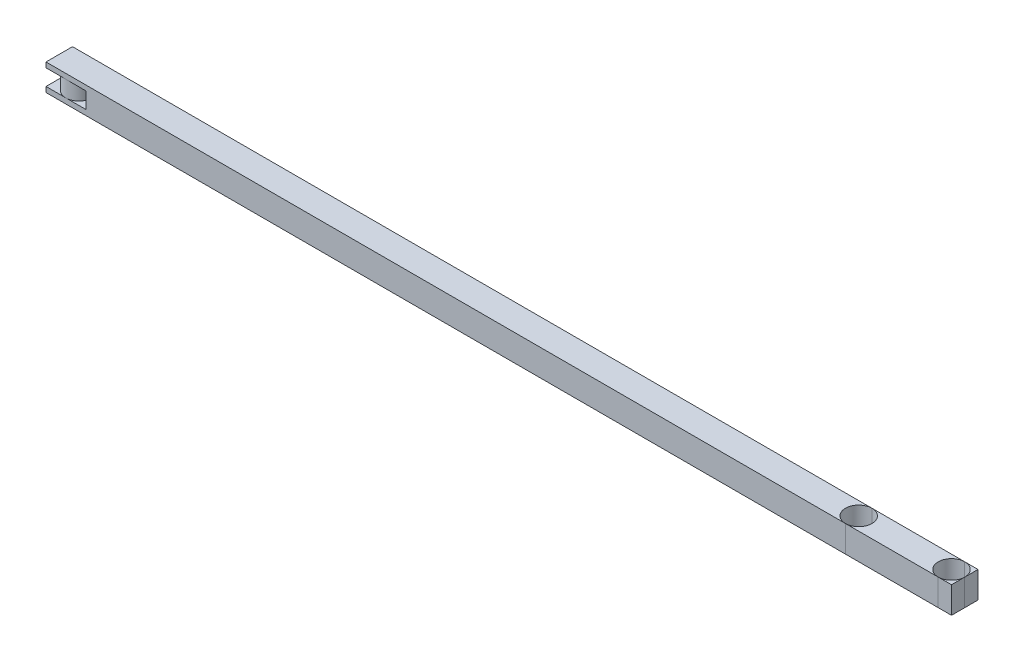
ISO-10303-21;
HEADER;
FILE_DESCRIPTION(('STEP AP214'),'2;1');
FILE_NAME('part.step','',(''),(''),'','','');
FILE_SCHEMA(('AUTOMOTIVE_DESIGN { 1 0 10303 214 1 1 1 1 }'));
ENDSEC;
DATA;
#1=APPLICATION_CONTEXT('core data for automotive mechanical design processes');
#2=APPLICATION_PROTOCOL_DEFINITION('international standard','automotive_design',2000,#1);
#3=PRODUCT_CONTEXT('',#1,'mechanical');
#4=PRODUCT('Part','Part','',(#3));
#5=PRODUCT_RELATED_PRODUCT_CATEGORY('part','',(#4));
#6=PRODUCT_DEFINITION_FORMATION('','',#4);
#7=PRODUCT_DEFINITION_CONTEXT('part definition',#1,'design');
#8=PRODUCT_DEFINITION('design','',#6,#7);
#9=PRODUCT_DEFINITION_SHAPE('','',#8);
#10=(LENGTH_UNIT() NAMED_UNIT(*) SI_UNIT(.MILLI.,.METRE.));
#11=(NAMED_UNIT(*) PLANE_ANGLE_UNIT() SI_UNIT($,.RADIAN.));
#12=(NAMED_UNIT(*) SI_UNIT($,.STERADIAN.) SOLID_ANGLE_UNIT());
#13=UNCERTAINTY_MEASURE_WITH_UNIT(LENGTH_MEASURE(1.E-05),#10,'distance_accuracy_value','');
#14=(GEOMETRIC_REPRESENTATION_CONTEXT(3) GLOBAL_UNCERTAINTY_ASSIGNED_CONTEXT((#13)) GLOBAL_UNIT_ASSIGNED_CONTEXT((#10,
#11,#12)) REPRESENTATION_CONTEXT('',''));
#15=CARTESIAN_POINT('',(0.,0.,0.));
#16=DIRECTION('',(0.,0.,1.));
#17=DIRECTION('',(1.,0.,0.));
#18=AXIS2_PLACEMENT_3D('',#15,#16,#17);
#19=CARTESIAN_POINT('',(0.,0.,5.));
#20=DIRECTION('',(0.,0.,-1.));
#21=DIRECTION('',(-1.,0.,0.));
#22=AXIS2_PLACEMENT_3D('',#19,#20,#21);
#23=PLANE('',#22);
#24=DIRECTION('',(1.,0.,0.));
#25=VECTOR('',#24,1.);
#26=CARTESIAN_POINT('',(170.8,-5.,5.));
#27=LINE('',#26,#25);
#28=CARTESIAN_POINT('',(0.,-5.00000000000005,5.));
#29=VERTEX_POINT('',#28);
#30=CARTESIAN_POINT('',(150.8,-5.00000000000001,5.));
#31=VERTEX_POINT('',#30);
#32=EDGE_CURVE('E148',#29,#31,#27,.T.);
#33=ORIENTED_EDGE('',*,*,#32,.T.);
#34=DIRECTION('',(0.,1.,0.));
#35=VECTOR('',#34,1.);
#36=CARTESIAN_POINT('',(150.8,-10.,5.));
#37=LINE('',#36,#35);
#38=CARTESIAN_POINT('',(150.8,0.,5.));
#39=VERTEX_POINT('',#38);
#40=EDGE_CURVE('E69',#31,#39,#37,.T.);
#41=ORIENTED_EDGE('',*,*,#40,.T.);
#42=DIRECTION('',(-1.,0.,0.));
#43=VECTOR('',#42,1.);
#44=CARTESIAN_POINT('',(0.,0.,5.));
#45=LINE('',#44,#43);
#46=CARTESIAN_POINT('',(0.,0.,5.));
#47=VERTEX_POINT('',#46);
#48=EDGE_CURVE('E150',#39,#47,#45,.T.);
#49=ORIENTED_EDGE('',*,*,#48,.T.);
#50=DIRECTION('',(0.,-1.,0.));
#51=VECTOR('',#50,1.);
#52=CARTESIAN_POINT('',(0.,-0.958682323824163,5.));
#53=LINE('',#52,#51);
#54=CARTESIAN_POINT('',(0.,-0.958682323824163,5.));
#55=VERTEX_POINT('',#54);
#56=EDGE_CURVE('E152',#47,#55,#53,.T.);
#57=ORIENTED_EDGE('',*,*,#56,.T.);
#58=DIRECTION('',(1.,0.,0.));
#59=VECTOR('',#58,1.);
#60=CARTESIAN_POINT('',(0.,-0.958682323824163,5.));
#61=LINE('',#60,#59);
#62=CARTESIAN_POINT('',(3.75,-0.958682323824163,5.));
#63=VERTEX_POINT('',#62);
#64=EDGE_CURVE('E172',#55,#63,#61,.T.);
#65=ORIENTED_EDGE('',*,*,#64,.T.);
#66=CARTESIAN_POINT('',(7.5,-0.958682323824163,5.));
#67=VERTEX_POINT('',#66);
#68=EDGE_CURVE('E174',#63,#67,#61,.T.);
#69=ORIENTED_EDGE('',*,*,#68,.T.);
#70=DIRECTION('',(0.,-1.,0.));
#71=VECTOR('',#70,1.);
#72=CARTESIAN_POINT('',(7.5,-0.958682323824163,5.));
#73=LINE('',#72,#71);
#74=CARTESIAN_POINT('',(7.5,-4.00000000000005,5.));
#75=VERTEX_POINT('',#74);
#76=EDGE_CURVE('E180',#67,#75,#73,.T.);
#77=ORIENTED_EDGE('',*,*,#76,.T.);
#78=DIRECTION('',(-1.,0.,0.));
#79=VECTOR('',#78,1.);
#80=CARTESIAN_POINT('',(7.5,-4.00000000000005,5.));
#81=LINE('',#80,#79);
#82=CARTESIAN_POINT('',(3.75,-4.00000000000005,5.));
#83=VERTEX_POINT('',#82);
#84=EDGE_CURVE('E182',#75,#83,#81,.T.);
#85=ORIENTED_EDGE('',*,*,#84,.T.);
#86=CARTESIAN_POINT('',(0.,-4.00000000000005,5.));
#87=VERTEX_POINT('',#86);
#88=EDGE_CURVE('E185',#83,#87,#81,.T.);
#89=ORIENTED_EDGE('',*,*,#88,.T.);
#90=DIRECTION('',(0.,-1.,0.));
#91=VECTOR('',#90,1.);
#92=CARTESIAN_POINT('',(0.,-5.00000000000005,5.));
#93=LINE('',#92,#91);
#94=EDGE_CURVE('E186',#87,#29,#93,.T.);
#95=ORIENTED_EDGE('',*,*,#94,.T.);
#96=EDGE_LOOP('',(#33,#41,#49,#57,#65,#69,#77,#85,#89,#95));
#97=FACE_BOUND('',#96,.T.);
#98=ADVANCED_FACE('F52',(#97),#23,.F.);
#99=CARTESIAN_POINT('',(0.,0.,0.));
#100=DIRECTION('',(0.,0.,-1.));
#101=DIRECTION('',(-1.,0.,0.));
#102=AXIS2_PLACEMENT_3D('',#99,#100,#101);
#103=PLANE('',#102);
#104=DIRECTION('',(0.,1.,0.));
#105=VECTOR('',#104,1.);
#106=CARTESIAN_POINT('',(150.8,-10.,0.));
#107=LINE('',#106,#105);
#108=CARTESIAN_POINT('',(150.8,-5.00000000000001,0.));
#109=VERTEX_POINT('',#108);
#110=CARTESIAN_POINT('',(150.8,0.,0.));
#111=VERTEX_POINT('',#110);
#112=EDGE_CURVE('E12',#109,#111,#107,.T.);
#113=ORIENTED_EDGE('',*,*,#112,.F.);
#114=DIRECTION('',(1.,0.,0.));
#115=VECTOR('',#114,1.);
#116=CARTESIAN_POINT('',(170.8,-5.,0.));
#117=LINE('',#116,#115);
#118=CARTESIAN_POINT('',(0.,-5.00000000000005,0.));
#119=VERTEX_POINT('',#118);
#120=EDGE_CURVE('E129',#119,#109,#117,.T.);
#121=ORIENTED_EDGE('',*,*,#120,.F.);
#122=DIRECTION('',(0.,-1.,0.));
#123=VECTOR('',#122,1.);
#124=CARTESIAN_POINT('',(0.,-5.00000000000005,0.));
#125=LINE('',#124,#123);
#126=CARTESIAN_POINT('',(0.,-4.00000000000005,0.));
#127=VERTEX_POINT('',#126);
#128=EDGE_CURVE('E143',#127,#119,#125,.T.);
#129=ORIENTED_EDGE('',*,*,#128,.F.);
#130=DIRECTION('',(-1.,0.,0.));
#131=VECTOR('',#130,1.);
#132=CARTESIAN_POINT('',(7.5,-4.00000000000005,0.));
#133=LINE('',#132,#131);
#134=CARTESIAN_POINT('',(3.75,-4.00000000000005,0.));
#135=VERTEX_POINT('',#134);
#136=EDGE_CURVE('E189',#135,#127,#133,.T.);
#137=ORIENTED_EDGE('',*,*,#136,.F.);
#138=CARTESIAN_POINT('',(7.5,-4.00000000000005,0.));
#139=VERTEX_POINT('',#138);
#140=EDGE_CURVE('E196',#139,#135,#133,.T.);
#141=ORIENTED_EDGE('',*,*,#140,.F.);
#142=DIRECTION('',(0.,-1.,0.));
#143=VECTOR('',#142,1.);
#144=CARTESIAN_POINT('',(7.5,-0.958682323824163,0.));
#145=LINE('',#144,#143);
#146=CARTESIAN_POINT('',(7.5,-0.958682323824163,0.));
#147=VERTEX_POINT('',#146);
#148=EDGE_CURVE('E193',#147,#139,#145,.T.);
#149=ORIENTED_EDGE('',*,*,#148,.F.);
#150=DIRECTION('',(1.,0.,0.));
#151=VECTOR('',#150,1.);
#152=CARTESIAN_POINT('',(0.,-0.958682323824163,0.));
#153=LINE('',#152,#151);
#154=CARTESIAN_POINT('',(3.75,-0.958682323824163,0.));
#155=VERTEX_POINT('',#154);
#156=EDGE_CURVE('E165',#155,#147,#153,.T.);
#157=ORIENTED_EDGE('',*,*,#156,.F.);
#158=CARTESIAN_POINT('',(0.,-0.958682323824163,0.));
#159=VERTEX_POINT('',#158);
#160=EDGE_CURVE('E190',#159,#155,#153,.T.);
#161=ORIENTED_EDGE('',*,*,#160,.F.);
#162=DIRECTION('',(0.,-1.,0.));
#163=VECTOR('',#162,1.);
#164=CARTESIAN_POINT('',(0.,-0.958682323824163,0.));
#165=LINE('',#164,#163);
#166=CARTESIAN_POINT('',(0.,0.,0.));
#167=VERTEX_POINT('',#166);
#168=EDGE_CURVE('E166',#167,#159,#165,.T.);
#169=ORIENTED_EDGE('',*,*,#168,.F.);
#170=DIRECTION('',(-1.,0.,0.));
#171=VECTOR('',#170,1.);
#172=CARTESIAN_POINT('',(0.,0.,0.));
#173=LINE('',#172,#171);
#174=EDGE_CURVE('E135',#111,#167,#173,.T.);
#175=ORIENTED_EDGE('',*,*,#174,.F.);
#176=EDGE_LOOP('',(#113,#121,#129,#137,#141,#149,#157,#161,#169,#175));
#177=FACE_BOUND('',#176,.T.);
#178=ADVANCED_FACE('F132',(#177),#103,.T.);
#179=CARTESIAN_POINT('',(0.,-0.958682323824163,5.));
#180=DIRECTION('',(0.,1.,0.));
#181=DIRECTION('',(0.,0.,1.));
#182=AXIS2_PLACEMENT_3D('',#179,#180,#181);
#183=PLANE('',#182);
#184=CARTESIAN_POINT('',(3.75,-0.958682323824163,2.5));
#185=DIRECTION('',(0.,-1.,0.));
#186=DIRECTION('',(0.,0.,-1.));
#187=AXIS2_PLACEMENT_3D('',#184,#185,#186);
#188=CIRCLE('',#187,2.5);
#189=EDGE_CURVE('E62',#63,#155,#188,.T.);
#190=ORIENTED_EDGE('',*,*,#189,.F.);
#191=ORIENTED_EDGE('',*,*,#64,.F.);
#192=DIRECTION('',(0.,0.,-1.));
#193=VECTOR('',#192,1.);
#194=CARTESIAN_POINT('',(0.,-0.958682323824163,5.));
#195=LINE('',#194,#193);
#196=EDGE_CURVE('E171',#55,#159,#195,.T.);
#197=ORIENTED_EDGE('',*,*,#196,.T.);
#198=ORIENTED_EDGE('',*,*,#160,.T.);
#199=EDGE_LOOP('',(#190,#191,#197,#198));
#200=FACE_BOUND('',#199,.T.);
#201=ADVANCED_FACE('F207',(#200),#183,.F.);
#202=CARTESIAN_POINT('',(7.5,-4.00000000000005,5.));
#203=DIRECTION('',(0.,-1.,0.));
#204=DIRECTION('',(1.,0.,0.));
#205=AXIS2_PLACEMENT_3D('',#202,#203,#204);
#206=PLANE('',#205);
#207=CARTESIAN_POINT('',(3.75,-4.00000000000005,2.5));
#208=DIRECTION('',(0.,-1.,0.));
#209=DIRECTION('',(1.,0.,0.));
#210=AXIS2_PLACEMENT_3D('',#207,#208,#209);
#211=CIRCLE('',#210,2.5);
#212=EDGE_CURVE('E177',#83,#135,#211,.T.);
#213=ORIENTED_EDGE('',*,*,#212,.T.);
#214=ORIENTED_EDGE('',*,*,#136,.T.);
#215=DIRECTION('',(0.,0.,-1.));
#216=VECTOR('',#215,1.);
#217=CARTESIAN_POINT('',(0.,-4.00000000000005,5.));
#218=LINE('',#217,#216);
#219=EDGE_CURVE('E140',#87,#127,#218,.T.);
#220=ORIENTED_EDGE('',*,*,#219,.F.);
#221=ORIENTED_EDGE('',*,*,#88,.F.);
#222=EDGE_LOOP('',(#213,#214,#220,#221));
#223=FACE_BOUND('',#222,.T.);
#224=ADVANCED_FACE('F238',(#223),#206,.F.);
#225=CARTESIAN_POINT('',(0.,-0.958682323824163,5.));
#226=DIRECTION('',(1.,0.,0.));
#227=DIRECTION('',(0.,1.,0.));
#228=AXIS2_PLACEMENT_3D('',#225,#226,#227);
#229=PLANE('',#228);
#230=ORIENTED_EDGE('',*,*,#168,.T.);
#231=ORIENTED_EDGE('',*,*,#196,.F.);
#232=ORIENTED_EDGE('',*,*,#56,.F.);
#233=DIRECTION('',(0.,0.,-1.));
#234=VECTOR('',#233,1.);
#235=CARTESIAN_POINT('',(0.,0.,5.));
#236=LINE('',#235,#234);
#237=EDGE_CURVE('E161',#47,#167,#236,.T.);
#238=ORIENTED_EDGE('',*,*,#237,.T.);
#239=EDGE_LOOP('',(#230,#231,#232,#238));
#240=FACE_BOUND('',#239,.T.);
#241=ADVANCED_FACE('F169',(#240),#229,.F.);
#242=EDGE_CURVE('E218',#155,#63,#188,.T.);
#243=ORIENTED_EDGE('',*,*,#242,.F.);
#244=ORIENTED_EDGE('',*,*,#156,.T.);
#245=DIRECTION('',(0.,0.,-1.));
#246=VECTOR('',#245,1.);
#247=CARTESIAN_POINT('',(7.5,-0.958682323824163,5.));
#248=LINE('',#247,#246);
#249=EDGE_CURVE('E195',#67,#147,#248,.T.);
#250=ORIENTED_EDGE('',*,*,#249,.F.);
#251=ORIENTED_EDGE('',*,*,#68,.F.);
#252=EDGE_LOOP('',(#243,#244,#250,#251));
#253=FACE_BOUND('',#252,.T.);
#254=ADVANCED_FACE('F214',(#253),#183,.F.);
#255=CARTESIAN_POINT('',(7.5,-0.958682323824163,5.));
#256=DIRECTION('',(1.,0.,0.));
#257=DIRECTION('',(0.,0.,-1.));
#258=AXIS2_PLACEMENT_3D('',#255,#256,#257);
#259=PLANE('',#258);
#260=ORIENTED_EDGE('',*,*,#148,.T.);
#261=DIRECTION('',(0.,0.,-1.));
#262=VECTOR('',#261,1.);
#263=CARTESIAN_POINT('',(7.5,-4.00000000000005,5.));
#264=LINE('',#263,#262);
#265=EDGE_CURVE('E198',#75,#139,#264,.T.);
#266=ORIENTED_EDGE('',*,*,#265,.F.);
#267=ORIENTED_EDGE('',*,*,#76,.F.);
#268=ORIENTED_EDGE('',*,*,#249,.T.);
#269=EDGE_LOOP('',(#260,#266,#267,#268));
#270=FACE_BOUND('',#269,.T.);
#271=ADVANCED_FACE('F220',(#270),#259,.F.);
#272=EDGE_CURVE('E203',#135,#83,#211,.T.);
#273=ORIENTED_EDGE('',*,*,#272,.T.);
#274=ORIENTED_EDGE('',*,*,#84,.F.);
#275=ORIENTED_EDGE('',*,*,#265,.T.);
#276=ORIENTED_EDGE('',*,*,#140,.T.);
#277=EDGE_LOOP('',(#273,#274,#275,#276));
#278=FACE_BOUND('',#277,.T.);
#279=ADVANCED_FACE('F235',(#278),#206,.F.);
#280=CARTESIAN_POINT('',(0.,-5.00000000000005,5.));
#281=DIRECTION('',(1.,0.,0.));
#282=DIRECTION('',(0.,1.,0.));
#283=AXIS2_PLACEMENT_3D('',#280,#281,#282);
#284=PLANE('',#283);
#285=ORIENTED_EDGE('',*,*,#128,.T.);
#286=DIRECTION('',(0.,0.,-1.));
#287=VECTOR('',#286,1.);
#288=CARTESIAN_POINT('',(0.,-5.00000000000005,5.));
#289=LINE('',#288,#287);
#290=EDGE_CURVE('E128',#29,#119,#289,.T.);
#291=ORIENTED_EDGE('',*,*,#290,.F.);
#292=ORIENTED_EDGE('',*,*,#94,.F.);
#293=ORIENTED_EDGE('',*,*,#219,.T.);
#294=EDGE_LOOP('',(#285,#291,#292,#293));
#295=FACE_BOUND('',#294,.T.);
#296=ADVANCED_FACE('F241',(#295),#284,.F.);
#297=CARTESIAN_POINT('',(170.8,-5.,5.));
#298=DIRECTION('',(0.,1.,0.));
#299=DIRECTION('',(-1.,0.,0.));
#300=AXIS2_PLACEMENT_3D('',#297,#298,#299);
#301=PLANE('',#300);
#302=ORIENTED_EDGE('',*,*,#120,.T.);
#303=CARTESIAN_POINT('',(150.8,-5.00000000000001,2.5));
#304=DIRECTION('',(0.,1.,0.));
#305=DIRECTION('',(-1.,0.,0.));
#306=AXIS2_PLACEMENT_3D('',#303,#304,#305);
#307=CIRCLE('',#306,2.5);
#308=EDGE_CURVE('E56',#109,#31,#307,.T.);
#309=ORIENTED_EDGE('',*,*,#308,.T.);
#310=ORIENTED_EDGE('',*,*,#32,.F.);
#311=ORIENTED_EDGE('',*,*,#290,.T.);
#312=EDGE_LOOP('',(#302,#309,#310,#311));
#313=FACE_BOUND('',#312,.T.);
#314=ADVANCED_FACE('F138',(#313),#301,.F.);
#315=CARTESIAN_POINT('',(0.,0.,5.));
#316=DIRECTION('',(0.,-1.,0.));
#317=DIRECTION('',(0.,0.,-1.));
#318=AXIS2_PLACEMENT_3D('',#315,#316,#317);
#319=PLANE('',#318);
#320=ORIENTED_EDGE('',*,*,#48,.F.);
#321=CARTESIAN_POINT('',(150.8,0.,2.5));
#322=DIRECTION('',(0.,-1.,0.));
#323=DIRECTION('',(0.,0.,-1.));
#324=AXIS2_PLACEMENT_3D('',#321,#322,#323);
#325=CIRCLE('',#324,2.5);
#326=EDGE_CURVE('E159',#39,#111,#325,.T.);
#327=ORIENTED_EDGE('',*,*,#326,.T.);
#328=ORIENTED_EDGE('',*,*,#174,.T.);
#329=ORIENTED_EDGE('',*,*,#237,.F.);
#330=EDGE_LOOP('',(#320,#327,#328,#329));
#331=FACE_BOUND('',#330,.T.);
#332=ADVANCED_FACE('F158',(#331),#319,.F.);
#333=CARTESIAN_POINT('',(3.75,-11.0710678118655,2.5));
#334=DIRECTION('',(0.,1.,0.));
#335=DIRECTION('',(0.,0.,1.));
#336=AXIS2_PLACEMENT_3D('',#333,#334,#335);
#337=CYLINDRICAL_SURFACE('',#336,2.5);
#338=ORIENTED_EDGE('',*,*,#242,.T.);
#339=ORIENTED_EDGE('',*,*,#189,.T.);
#340=EDGE_LOOP('',(#338,#339));
#341=FACE_BOUND('',#340,.T.);
#342=ORIENTED_EDGE('',*,*,#212,.F.);
#343=ORIENTED_EDGE('',*,*,#272,.F.);
#344=EDGE_LOOP('',(#342,#343));
#345=FACE_BOUND('',#344,.T.);
#346=ADVANCED_FACE('F225',(#341,#345),#337,.T.);
#347=CARTESIAN_POINT('',(150.8,-10.,2.5));
#348=DIRECTION('',(0.,1.,0.));
#349=DIRECTION('',(0.,0.,1.));
#350=AXIS2_PLACEMENT_3D('',#347,#348,#349);
#351=CYLINDRICAL_SURFACE('',#350,2.5);
#352=ORIENTED_EDGE('',*,*,#308,.F.);
#353=ORIENTED_EDGE('',*,*,#112,.T.);
#354=ORIENTED_EDGE('',*,*,#326,.F.);
#355=ORIENTED_EDGE('',*,*,#40,.F.);
#356=EDGE_LOOP('',(#352,#353,#354,#355));
#357=FACE_BOUND('',#356,.T.);
#358=ADVANCED_FACE('F54',(#357),#351,.F.);
#359=CLOSED_SHELL('',(#98,#178,#201,#224,#241,#254,#271,#279,#296,#314,#332,#346,#358));
#360=MANIFOLD_SOLID_BREP('B2',#359);
#361=CARTESIAN_POINT('',(168.3,5.00000000000004,2.5));
#362=DIRECTION('',(0.,-1.,0.));
#363=DIRECTION('',(1.,0.,0.));
#364=AXIS2_PLACEMENT_3D('',#361,#362,#363);
#365=CYLINDRICAL_SURFACE('',#364,2.5);
#366=DIRECTION('',(0.,-1.,0.));
#367=VECTOR('',#366,1.);
#368=CARTESIAN_POINT('',(168.3,5.00000000000004,5.));
#369=LINE('',#368,#367);
#370=CARTESIAN_POINT('',(168.3,0.,5.));
#371=VERTEX_POINT('',#370);
#372=CARTESIAN_POINT('',(168.3,-4.99999999999996,5.));
#373=VERTEX_POINT('',#372);
#374=EDGE_CURVE('E361',#371,#373,#369,.T.);
#375=ORIENTED_EDGE('',*,*,#374,.T.);
#376=CARTESIAN_POINT('',(168.3,-4.99999999999996,2.5));
#377=DIRECTION('',(0.,-1.,0.));
#378=DIRECTION('',(1.,0.,0.));
#379=AXIS2_PLACEMENT_3D('',#376,#377,#378);
#380=CIRCLE('',#379,2.5);
#381=CARTESIAN_POINT('',(168.3,-5.,0.));
#382=VERTEX_POINT('',#381);
#383=EDGE_CURVE('E50',#373,#382,#380,.T.);
#384=ORIENTED_EDGE('',*,*,#383,.T.);
#385=DIRECTION('',(0.,-1.,0.));
#386=VECTOR('',#385,1.);
#387=CARTESIAN_POINT('',(168.3,5.00000000000004,0.));
#388=LINE('',#387,#386);
#389=CARTESIAN_POINT('',(168.3,0.,0.));
#390=VERTEX_POINT('',#389);
#391=EDGE_CURVE('E411',#390,#382,#388,.T.);
#392=ORIENTED_EDGE('',*,*,#391,.F.);
#393=CARTESIAN_POINT('',(168.3,0.,2.5));
#394=DIRECTION('',(0.,-1.,0.));
#395=DIRECTION('',(0.,0.,-1.));
#396=AXIS2_PLACEMENT_3D('',#393,#394,#395);
#397=CIRCLE('',#396,2.5);
#398=EDGE_CURVE('E408',#371,#390,#397,.T.);
#399=ORIENTED_EDGE('',*,*,#398,.F.);
#400=EDGE_LOOP('',(#375,#384,#392,#399));
#401=FACE_BOUND('',#400,.T.);
#402=ADVANCED_FACE('F353',(#401),#365,.F.);
#403=CARTESIAN_POINT('',(0.,0.,5.));
#404=DIRECTION('',(0.,-1.,0.));
#405=DIRECTION('',(0.,0.,-1.));
#406=AXIS2_PLACEMENT_3D('',#403,#404,#405);
#407=PLANE('',#406);
#408=DIRECTION('',(-1.,0.,0.));
#409=VECTOR('',#408,1.);
#410=CARTESIAN_POINT('',(0.,0.,0.));
#411=LINE('',#410,#409);
#412=CARTESIAN_POINT('',(150.8,0.,0.));
#413=VERTEX_POINT('',#412);
#414=EDGE_CURVE('E356',#390,#413,#411,.T.);
#415=ORIENTED_EDGE('',*,*,#414,.T.);
#416=CARTESIAN_POINT('',(150.8,0.,2.5));
#417=DIRECTION('',(0.,1.,0.));
#418=DIRECTION('',(0.,0.,1.));
#419=AXIS2_PLACEMENT_3D('',#416,#417,#418);
#420=CIRCLE('',#419,2.5);
#421=CARTESIAN_POINT('',(150.8,0.,5.));
#422=VERTEX_POINT('',#421);
#423=EDGE_CURVE('E392',#422,#413,#420,.T.);
#424=ORIENTED_EDGE('',*,*,#423,.F.);
#425=DIRECTION('',(-1.,0.,0.));
#426=VECTOR('',#425,1.);
#427=CARTESIAN_POINT('',(0.,0.,5.));
#428=LINE('',#427,#426);
#429=EDGE_CURVE('E417',#371,#422,#428,.T.);
#430=ORIENTED_EDGE('',*,*,#429,.F.);
#431=ORIENTED_EDGE('',*,*,#398,.T.);
#432=EDGE_LOOP('',(#415,#424,#430,#431));
#433=FACE_BOUND('',#432,.T.);
#434=ADVANCED_FACE('F407',(#433),#407,.F.);
#435=CARTESIAN_POINT('',(170.8,-5.,5.));
#436=DIRECTION('',(0.,1.,0.));
#437=DIRECTION('',(-1.,0.,0.));
#438=AXIS2_PLACEMENT_3D('',#435,#436,#437);
#439=PLANE('',#438);
#440=DIRECTION('',(1.,0.,0.));
#441=VECTOR('',#440,1.);
#442=CARTESIAN_POINT('',(170.8,-5.,5.));
#443=LINE('',#442,#441);
#444=CARTESIAN_POINT('',(150.8,-5.00000000000001,5.));
#445=VERTEX_POINT('',#444);
#446=EDGE_CURVE('E414',#445,#373,#443,.T.);
#447=ORIENTED_EDGE('',*,*,#446,.F.);
#448=CARTESIAN_POINT('',(150.8,-5.00000000000001,2.5));
#449=DIRECTION('',(0.,1.,0.));
#450=DIRECTION('',(-1.,0.,0.));
#451=AXIS2_PLACEMENT_3D('',#448,#449,#450);
#452=CIRCLE('',#451,2.5);
#453=CARTESIAN_POINT('',(150.8,-5.00000000000001,0.));
#454=VERTEX_POINT('',#453);
#455=EDGE_CURVE('E397',#445,#454,#452,.T.);
#456=ORIENTED_EDGE('',*,*,#455,.T.);
#457=DIRECTION('',(1.,0.,0.));
#458=VECTOR('',#457,1.);
#459=CARTESIAN_POINT('',(170.8,-5.,0.));
#460=LINE('',#459,#458);
#461=EDGE_CURVE('E404',#454,#382,#460,.T.);
#462=ORIENTED_EDGE('',*,*,#461,.T.);
#463=ORIENTED_EDGE('',*,*,#383,.F.);
#464=EDGE_LOOP('',(#447,#456,#462,#463));
#465=FACE_BOUND('',#464,.T.);
#466=ADVANCED_FACE('F422',(#465),#439,.F.);
#467=CARTESIAN_POINT('',(0.,0.,0.));
#468=DIRECTION('',(0.,0.,-1.));
#469=DIRECTION('',(-1.,0.,0.));
#470=AXIS2_PLACEMENT_3D('',#467,#468,#469);
#471=PLANE('',#470);
#472=ORIENTED_EDGE('',*,*,#461,.F.);
#473=DIRECTION('',(0.,1.,0.));
#474=VECTOR('',#473,1.);
#475=CARTESIAN_POINT('',(150.8,-10.,0.));
#476=LINE('',#475,#474);
#477=EDGE_CURVE('E369',#454,#413,#476,.T.);
#478=ORIENTED_EDGE('',*,*,#477,.T.);
#479=ORIENTED_EDGE('',*,*,#414,.F.);
#480=ORIENTED_EDGE('',*,*,#391,.T.);
#481=EDGE_LOOP('',(#472,#478,#479,#480));
#482=FACE_BOUND('',#481,.T.);
#483=ADVANCED_FACE('F401',(#482),#471,.T.);
#484=CARTESIAN_POINT('',(0.,0.,5.));
#485=DIRECTION('',(0.,0.,-1.));
#486=DIRECTION('',(-1.,0.,0.));
#487=AXIS2_PLACEMENT_3D('',#484,#485,#486);
#488=PLANE('',#487);
#489=DIRECTION('',(0.,1.,0.));
#490=VECTOR('',#489,1.);
#491=CARTESIAN_POINT('',(150.8,-10.,5.));
#492=LINE('',#491,#490);
#493=EDGE_CURVE('E374',#445,#422,#492,.T.);
#494=ORIENTED_EDGE('',*,*,#493,.F.);
#495=ORIENTED_EDGE('',*,*,#446,.T.);
#496=ORIENTED_EDGE('',*,*,#374,.F.);
#497=ORIENTED_EDGE('',*,*,#429,.T.);
#498=EDGE_LOOP('',(#494,#495,#496,#497));
#499=FACE_BOUND('',#498,.T.);
#500=ADVANCED_FACE('F425',(#499),#488,.F.);
#501=CARTESIAN_POINT('',(150.8,-10.,2.5));
#502=DIRECTION('',(0.,1.,0.));
#503=DIRECTION('',(0.,0.,1.));
#504=AXIS2_PLACEMENT_3D('',#501,#502,#503);
#505=CYLINDRICAL_SURFACE('',#504,2.5);
#506=ORIENTED_EDGE('',*,*,#493,.T.);
#507=ORIENTED_EDGE('',*,*,#423,.T.);
#508=ORIENTED_EDGE('',*,*,#477,.F.);
#509=ORIENTED_EDGE('',*,*,#455,.F.);
#510=EDGE_LOOP('',(#506,#507,#508,#509));
#511=FACE_BOUND('',#510,.T.);
#512=ADVANCED_FACE('F393',(#511),#505,.F.);
#513=CLOSED_SHELL('',(#402,#434,#466,#483,#500,#512));
#514=MANIFOLD_SOLID_BREP('B6',#513);
#515=CARTESIAN_POINT('',(0.,0.,0.));
#516=DIRECTION('',(0.,0.,-1.));
#517=DIRECTION('',(-1.,0.,0.));
#518=AXIS2_PLACEMENT_3D('',#515,#516,#517);
#519=PLANE('',#518);
#520=DIRECTION('',(0.,-1.,0.));
#521=VECTOR('',#520,1.);
#522=CARTESIAN_POINT('',(168.3,5.00000000000004,0.));
#523=LINE('',#522,#521);
#524=CARTESIAN_POINT('',(168.3,0.,0.));
#525=VERTEX_POINT('',#524);
#526=CARTESIAN_POINT('',(168.3,-4.99999999999996,0.));
#527=VERTEX_POINT('',#526);
#528=EDGE_CURVE('E496',#525,#527,#523,.T.);
#529=ORIENTED_EDGE('',*,*,#528,.F.);
#530=DIRECTION('',(-1.,0.,0.));
#531=VECTOR('',#530,1.);
#532=CARTESIAN_POINT('',(0.,0.,0.));
#533=LINE('',#532,#531);
#534=CARTESIAN_POINT('',(170.8,0.,0.));
#535=VERTEX_POINT('',#534);
#536=EDGE_CURVE('E532',#535,#525,#533,.T.);
#537=ORIENTED_EDGE('',*,*,#536,.F.);
#538=DIRECTION('',(0.,1.,0.));
#539=VECTOR('',#538,1.);
#540=CARTESIAN_POINT('',(170.8,0.,0.));
#541=LINE('',#540,#539);
#542=CARTESIAN_POINT('',(170.8,-5.,0.));
#543=VERTEX_POINT('',#542);
#544=EDGE_CURVE('E522',#543,#535,#541,.T.);
#545=ORIENTED_EDGE('',*,*,#544,.F.);
#546=DIRECTION('',(1.,0.,0.));
#547=VECTOR('',#546,1.);
#548=CARTESIAN_POINT('',(170.8,-5.,0.));
#549=LINE('',#548,#547);
#550=EDGE_CURVE('E528',#527,#543,#549,.T.);
#551=ORIENTED_EDGE('',*,*,#550,.F.);
#552=EDGE_LOOP('',(#529,#537,#545,#551));
#553=FACE_BOUND('',#552,.T.);
#554=ADVANCED_FACE('F486',(#553),#519,.T.);
#555=CARTESIAN_POINT('',(0.,0.,5.));
#556=DIRECTION('',(0.,-1.,0.));
#557=DIRECTION('',(0.,0.,-1.));
#558=AXIS2_PLACEMENT_3D('',#555,#556,#557);
#559=PLANE('',#558);
#560=ORIENTED_EDGE('',*,*,#536,.T.);
#561=CARTESIAN_POINT('',(168.3,0.,2.5));
#562=DIRECTION('',(0.,-1.,0.));
#563=DIRECTION('',(0.,0.,-1.));
#564=AXIS2_PLACEMENT_3D('',#561,#562,#563);
#565=CIRCLE('',#564,2.5);
#566=CARTESIAN_POINT('',(170.8,0.,2.5));
#567=VERTEX_POINT('',#566);
#568=EDGE_CURVE('E490',#525,#567,#565,.T.);
#569=ORIENTED_EDGE('',*,*,#568,.T.);
#570=DIRECTION('',(0.,0.,-1.));
#571=VECTOR('',#570,1.);
#572=CARTESIAN_POINT('',(170.8,0.,5.));
#573=LINE('',#572,#571);
#574=EDGE_CURVE('E537',#567,#535,#573,.T.);
#575=ORIENTED_EDGE('',*,*,#574,.T.);
#576=EDGE_LOOP('',(#560,#569,#575));
#577=FACE_BOUND('',#576,.T.);
#578=ADVANCED_FACE('F541',(#577),#559,.F.);
#579=CARTESIAN_POINT('',(170.8,0.,5.));
#580=DIRECTION('',(-1.,0.,0.));
#581=DIRECTION('',(0.,0.,1.));
#582=AXIS2_PLACEMENT_3D('',#579,#580,#581);
#583=PLANE('',#582);
#584=ORIENTED_EDGE('',*,*,#574,.F.);
#585=DIRECTION('',(0.,-1.,0.));
#586=VECTOR('',#585,1.);
#587=CARTESIAN_POINT('',(170.8,5.00000000000004,2.5));
#588=LINE('',#587,#586);
#589=CARTESIAN_POINT('',(170.8,-4.99999999999995,2.5));
#590=VERTEX_POINT('',#589);
#591=EDGE_CURVE('E503',#567,#590,#588,.T.);
#592=ORIENTED_EDGE('',*,*,#591,.T.);
#593=DIRECTION('',(0.,0.,-1.));
#594=VECTOR('',#593,1.);
#595=CARTESIAN_POINT('',(170.8,-5.,5.));
#596=LINE('',#595,#594);
#597=EDGE_CURVE('E518',#590,#543,#596,.T.);
#598=ORIENTED_EDGE('',*,*,#597,.T.);
#599=ORIENTED_EDGE('',*,*,#544,.T.);
#600=EDGE_LOOP('',(#584,#592,#598,#599));
#601=FACE_BOUND('',#600,.T.);
#602=ADVANCED_FACE('F520',(#601),#583,.F.);
#603=CARTESIAN_POINT('',(170.8,-5.,5.));
#604=DIRECTION('',(0.,1.,0.));
#605=DIRECTION('',(-1.,0.,0.));
#606=AXIS2_PLACEMENT_3D('',#603,#604,#605);
#607=PLANE('',#606);
#608=ORIENTED_EDGE('',*,*,#597,.F.);
#609=CARTESIAN_POINT('',(168.3,-4.99999999999996,2.5));
#610=DIRECTION('',(0.,-1.,0.));
#611=DIRECTION('',(1.,0.,0.));
#612=AXIS2_PLACEMENT_3D('',#609,#610,#611);
#613=CIRCLE('',#612,2.5);
#614=EDGE_CURVE('E351',#527,#590,#613,.T.);
#615=ORIENTED_EDGE('',*,*,#614,.F.);
#616=ORIENTED_EDGE('',*,*,#550,.T.);
#617=EDGE_LOOP('',(#608,#615,#616));
#618=FACE_BOUND('',#617,.T.);
#619=ADVANCED_FACE('F488',(#618),#607,.F.);
#620=CARTESIAN_POINT('',(168.3,5.00000000000004,2.5));
#621=DIRECTION('',(0.,-1.,0.));
#622=DIRECTION('',(1.,0.,0.));
#623=AXIS2_PLACEMENT_3D('',#620,#621,#622);
#624=CYLINDRICAL_SURFACE('',#623,2.5);
#625=ORIENTED_EDGE('',*,*,#568,.F.);
#626=ORIENTED_EDGE('',*,*,#528,.T.);
#627=ORIENTED_EDGE('',*,*,#614,.T.);
#628=ORIENTED_EDGE('',*,*,#591,.F.);
#629=EDGE_LOOP('',(#625,#626,#627,#628));
#630=FACE_BOUND('',#629,.T.);
#631=ADVANCED_FACE('F550',(#630),#624,.F.);
#632=CLOSED_SHELL('',(#554,#578,#602,#619,#631));
#633=MANIFOLD_SOLID_BREP('B44',#632);
#634=CARTESIAN_POINT('',(0.,0.,5.));
#635=DIRECTION('',(0.,0.,-1.));
#636=DIRECTION('',(-1.,0.,0.));
#637=AXIS2_PLACEMENT_3D('',#634,#635,#636);
#638=PLANE('',#637);
#639=DIRECTION('',(-1.,0.,0.));
#640=VECTOR('',#639,1.);
#641=CARTESIAN_POINT('',(0.,0.,5.));
#642=LINE('',#641,#640);
#643=CARTESIAN_POINT('',(170.8,0.,5.));
#644=VERTEX_POINT('',#643);
#645=CARTESIAN_POINT('',(168.3,0.,5.));
#646=VERTEX_POINT('',#645);
#647=EDGE_CURVE('E631',#644,#646,#642,.T.);
#648=ORIENTED_EDGE('',*,*,#647,.T.);
#649=DIRECTION('',(0.,-1.,0.));
#650=VECTOR('',#649,1.);
#651=CARTESIAN_POINT('',(168.3,5.00000000000004,5.));
#652=LINE('',#651,#650);
#653=CARTESIAN_POINT('',(168.3,-5.,5.));
#654=VERTEX_POINT('',#653);
#655=EDGE_CURVE('E603',#646,#654,#652,.T.);
#656=ORIENTED_EDGE('',*,*,#655,.T.);
#657=DIRECTION('',(1.,0.,0.));
#658=VECTOR('',#657,1.);
#659=CARTESIAN_POINT('',(170.8,-5.,5.));
#660=LINE('',#659,#658);
#661=CARTESIAN_POINT('',(170.8,-5.,5.));
#662=VERTEX_POINT('',#661);
#663=EDGE_CURVE('E628',#654,#662,#660,.T.);
#664=ORIENTED_EDGE('',*,*,#663,.T.);
#665=DIRECTION('',(0.,1.,0.));
#666=VECTOR('',#665,1.);
#667=CARTESIAN_POINT('',(170.8,0.,5.));
#668=LINE('',#667,#666);
#669=EDGE_CURVE('E632',#662,#644,#668,.T.);
#670=ORIENTED_EDGE('',*,*,#669,.T.);
#671=EDGE_LOOP('',(#648,#656,#664,#670));
#672=FACE_BOUND('',#671,.T.);
#673=ADVANCED_FACE('F584',(#672),#638,.F.);
#674=CARTESIAN_POINT('',(0.,0.,5.));
#675=DIRECTION('',(0.,-1.,0.));
#676=DIRECTION('',(0.,0.,-1.));
#677=AXIS2_PLACEMENT_3D('',#674,#675,#676);
#678=PLANE('',#677);
#679=DIRECTION('',(0.,0.,-1.));
#680=VECTOR('',#679,1.);
#681=CARTESIAN_POINT('',(170.8,0.,5.));
#682=LINE('',#681,#680);
#683=CARTESIAN_POINT('',(170.8,0.,2.5));
#684=VERTEX_POINT('',#683);
#685=EDGE_CURVE('E592',#644,#684,#682,.T.);
#686=ORIENTED_EDGE('',*,*,#685,.T.);
#687=CARTESIAN_POINT('',(168.3,0.,2.5));
#688=DIRECTION('',(0.,-1.,0.));
#689=DIRECTION('',(0.,0.,-1.));
#690=AXIS2_PLACEMENT_3D('',#687,#688,#689);
#691=CIRCLE('',#690,2.5);
#692=EDGE_CURVE('E615',#684,#646,#691,.T.);
#693=ORIENTED_EDGE('',*,*,#692,.T.);
#694=ORIENTED_EDGE('',*,*,#647,.F.);
#695=EDGE_LOOP('',(#686,#693,#694));
#696=FACE_BOUND('',#695,.T.);
#697=ADVANCED_FACE('F630',(#696),#678,.F.);
#698=CARTESIAN_POINT('',(170.8,0.,5.));
#699=DIRECTION('',(-1.,0.,0.));
#700=DIRECTION('',(0.,0.,1.));
#701=AXIS2_PLACEMENT_3D('',#698,#699,#700);
#702=PLANE('',#701);
#703=DIRECTION('',(0.,-1.,0.));
#704=VECTOR('',#703,1.);
#705=CARTESIAN_POINT('',(170.8,5.00000000000004,2.5));
#706=LINE('',#705,#704);
#707=CARTESIAN_POINT('',(170.8,-4.99999999999995,2.5));
#708=VERTEX_POINT('',#707);
#709=EDGE_CURVE('E599',#684,#708,#706,.T.);
#710=ORIENTED_EDGE('',*,*,#709,.F.);
#711=ORIENTED_EDGE('',*,*,#685,.F.);
#712=ORIENTED_EDGE('',*,*,#669,.F.);
#713=DIRECTION('',(0.,0.,-1.));
#714=VECTOR('',#713,1.);
#715=CARTESIAN_POINT('',(170.8,-5.,5.));
#716=LINE('',#715,#714);
#717=EDGE_CURVE('E484',#662,#708,#716,.T.);
#718=ORIENTED_EDGE('',*,*,#717,.T.);
#719=EDGE_LOOP('',(#710,#711,#712,#718));
#720=FACE_BOUND('',#719,.T.);
#721=ADVANCED_FACE('F624',(#720),#702,.F.);
#722=CARTESIAN_POINT('',(170.8,-5.,5.));
#723=DIRECTION('',(0.,1.,0.));
#724=DIRECTION('',(-1.,0.,0.));
#725=AXIS2_PLACEMENT_3D('',#722,#723,#724);
#726=PLANE('',#725);
#727=ORIENTED_EDGE('',*,*,#663,.F.);
#728=CARTESIAN_POINT('',(168.3,-4.99999999999996,2.5));
#729=DIRECTION('',(0.,-1.,0.));
#730=DIRECTION('',(1.,0.,0.));
#731=AXIS2_PLACEMENT_3D('',#728,#729,#730);
#732=CIRCLE('',#731,2.5);
#733=EDGE_CURVE('E620',#708,#654,#732,.T.);
#734=ORIENTED_EDGE('',*,*,#733,.F.);
#735=ORIENTED_EDGE('',*,*,#717,.F.);
#736=EDGE_LOOP('',(#727,#734,#735));
#737=FACE_BOUND('',#736,.T.);
#738=ADVANCED_FACE('F586',(#737),#726,.F.);
#739=CARTESIAN_POINT('',(168.3,5.00000000000004,2.5));
#740=DIRECTION('',(0.,-1.,0.));
#741=DIRECTION('',(1.,0.,0.));
#742=AXIS2_PLACEMENT_3D('',#739,#740,#741);
#743=CYLINDRICAL_SURFACE('',#742,2.5);
#744=ORIENTED_EDGE('',*,*,#709,.T.);
#745=ORIENTED_EDGE('',*,*,#733,.T.);
#746=ORIENTED_EDGE('',*,*,#655,.F.);
#747=ORIENTED_EDGE('',*,*,#692,.F.);
#748=EDGE_LOOP('',(#744,#745,#746,#747));
#749=FACE_BOUND('',#748,.T.);
#750=ADVANCED_FACE('F616',(#749),#743,.F.);
#751=CLOSED_SHELL('',(#673,#697,#721,#738,#750));
#752=MANIFOLD_SOLID_BREP('B345',#751);
#753=ADVANCED_BREP_SHAPE_REPRESENTATION('',(#18,#360,#514,#633,#752),#14);
#754=SHAPE_DEFINITION_REPRESENTATION(#9,#753);
ENDSEC;
END-ISO-10303-21;
